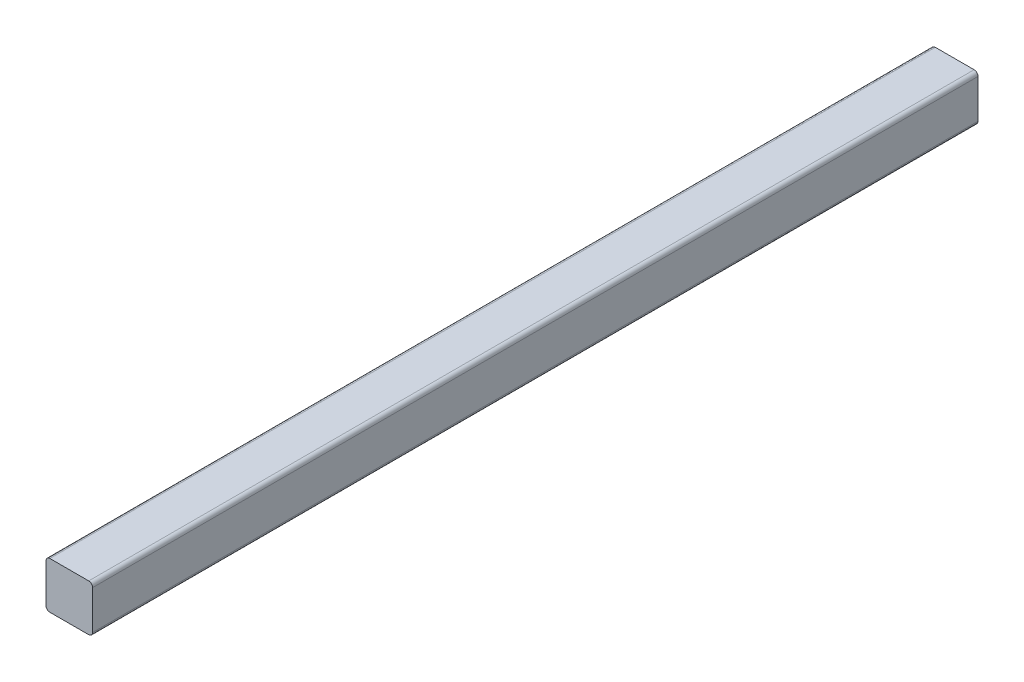
ISO-10303-21;
HEADER;
FILE_DESCRIPTION(('STEP AP214'),'2;1');
FILE_NAME('part.step','',(''),(''),'','','');
FILE_SCHEMA(('AUTOMOTIVE_DESIGN { 1 0 10303 214 1 1 1 1 }'));
ENDSEC;
DATA;
#1=APPLICATION_CONTEXT('core data for automotive mechanical design processes');
#2=APPLICATION_PROTOCOL_DEFINITION('international standard','automotive_design',2000,#1);
#3=PRODUCT_CONTEXT('',#1,'mechanical');
#4=PRODUCT('Part','Part','',(#3));
#5=PRODUCT_RELATED_PRODUCT_CATEGORY('part','',(#4));
#6=PRODUCT_DEFINITION_FORMATION('','',#4);
#7=PRODUCT_DEFINITION_CONTEXT('part definition',#1,'design');
#8=PRODUCT_DEFINITION('design','',#6,#7);
#9=PRODUCT_DEFINITION_SHAPE('','',#8);
#10=(LENGTH_UNIT() NAMED_UNIT(*) SI_UNIT(.MILLI.,.METRE.));
#11=(NAMED_UNIT(*) PLANE_ANGLE_UNIT() SI_UNIT($,.RADIAN.));
#12=(NAMED_UNIT(*) SI_UNIT($,.STERADIAN.) SOLID_ANGLE_UNIT());
#13=UNCERTAINTY_MEASURE_WITH_UNIT(LENGTH_MEASURE(1.E-05),#10,'distance_accuracy_value','');
#14=(GEOMETRIC_REPRESENTATION_CONTEXT(3) GLOBAL_UNCERTAINTY_ASSIGNED_CONTEXT((#13)) GLOBAL_UNIT_ASSIGNED_CONTEXT((#10,
#11,#12)) REPRESENTATION_CONTEXT('',''));
#15=CARTESIAN_POINT('',(0.,0.,0.));
#16=DIRECTION('',(0.,0.,1.));
#17=DIRECTION('',(1.,0.,0.));
#18=AXIS2_PLACEMENT_3D('',#15,#16,#17);
#19=CARTESIAN_POINT('',(19.05,-19.05,723.9));
#20=DIRECTION('',(-1.,0.,0.));
#21=DIRECTION('',(0.,0.,1.));
#22=AXIS2_PLACEMENT_3D('',#19,#20,#21);
#23=PLANE('',#22);
#24=DIRECTION('',(0.,1.,0.));
#25=VECTOR('',#24,1.);
#26=CARTESIAN_POINT('',(19.05,-19.05,723.9));
#27=LINE('',#26,#25);
#28=CARTESIAN_POINT('',(19.05,-15.875,723.9));
#29=VERTEX_POINT('',#28);
#30=CARTESIAN_POINT('',(19.05,15.875,723.9));
#31=VERTEX_POINT('',#30);
#32=EDGE_CURVE('E134',#29,#31,#27,.T.);
#33=ORIENTED_EDGE('',*,*,#32,.F.);
#34=DIRECTION('',(0.,0.,-1.));
#35=VECTOR('',#34,1.);
#36=CARTESIAN_POINT('',(19.05,-15.875,723.9));
#37=LINE('',#36,#35);
#38=CARTESIAN_POINT('',(19.05,-15.875,0.));
#39=VERTEX_POINT('',#38);
#40=EDGE_CURVE('E11',#29,#39,#37,.T.);
#41=ORIENTED_EDGE('',*,*,#40,.T.);
#42=DIRECTION('',(0.,1.,0.));
#43=VECTOR('',#42,1.);
#44=CARTESIAN_POINT('',(19.05,-19.05,0.));
#45=LINE('',#44,#43);
#46=CARTESIAN_POINT('',(19.05,15.875,0.));
#47=VERTEX_POINT('',#46);
#48=EDGE_CURVE('E136',#39,#47,#45,.T.);
#49=ORIENTED_EDGE('',*,*,#48,.T.);
#50=DIRECTION('',(0.,0.,-1.));
#51=VECTOR('',#50,1.);
#52=CARTESIAN_POINT('',(19.05,15.875,723.9));
#53=LINE('',#52,#51);
#54=EDGE_CURVE('E47',#47,#31,#53,.F.);
#55=ORIENTED_EDGE('',*,*,#54,.T.);
#56=EDGE_LOOP('',(#33,#41,#49,#55));
#57=FACE_BOUND('',#56,.T.);
#58=ADVANCED_FACE('F39',(#57),#23,.F.);
#59=CARTESIAN_POINT('',(-19.05,19.05,723.9));
#60=DIRECTION('',(0.,-1.,0.));
#61=DIRECTION('',(0.,0.,-1.));
#62=AXIS2_PLACEMENT_3D('',#59,#60,#61);
#63=PLANE('',#62);
#64=DIRECTION('',(-1.,0.,0.));
#65=VECTOR('',#64,1.);
#66=CARTESIAN_POINT('',(-19.05,19.05,0.));
#67=LINE('',#66,#65);
#68=CARTESIAN_POINT('',(15.875,19.05,0.));
#69=VERTEX_POINT('',#68);
#70=CARTESIAN_POINT('',(-15.875,19.05,0.));
#71=VERTEX_POINT('',#70);
#72=EDGE_CURVE('E132',#69,#71,#67,.T.);
#73=ORIENTED_EDGE('',*,*,#72,.T.);
#74=DIRECTION('',(0.,0.,-1.));
#75=VECTOR('',#74,1.);
#76=CARTESIAN_POINT('',(-15.875,19.05,723.9));
#77=LINE('',#76,#75);
#78=CARTESIAN_POINT('',(-15.875,19.05,723.9));
#79=VERTEX_POINT('',#78);
#80=EDGE_CURVE('E111',#71,#79,#77,.F.);
#81=ORIENTED_EDGE('',*,*,#80,.T.);
#82=DIRECTION('',(-1.,0.,0.));
#83=VECTOR('',#82,1.);
#84=CARTESIAN_POINT('',(-19.05,19.05,723.9));
#85=LINE('',#84,#83);
#86=CARTESIAN_POINT('',(15.875,19.05,723.9));
#87=VERTEX_POINT('',#86);
#88=EDGE_CURVE('E172',#87,#79,#85,.T.);
#89=ORIENTED_EDGE('',*,*,#88,.F.);
#90=DIRECTION('',(0.,0.,-1.));
#91=VECTOR('',#90,1.);
#92=CARTESIAN_POINT('',(15.875,19.05,723.9));
#93=LINE('',#92,#91);
#94=EDGE_CURVE('E116',#87,#69,#93,.T.);
#95=ORIENTED_EDGE('',*,*,#94,.T.);
#96=EDGE_LOOP('',(#73,#81,#89,#95));
#97=FACE_BOUND('',#96,.T.);
#98=ADVANCED_FACE('F176',(#97),#63,.F.);
#99=CARTESIAN_POINT('',(-19.05,-19.05,723.9));
#100=DIRECTION('',(1.,0.,0.));
#101=DIRECTION('',(0.,0.,-1.));
#102=AXIS2_PLACEMENT_3D('',#99,#100,#101);
#103=PLANE('',#102);
#104=DIRECTION('',(0.,-1.,0.));
#105=VECTOR('',#104,1.);
#106=CARTESIAN_POINT('',(-19.05,-19.05,723.9));
#107=LINE('',#106,#105);
#108=CARTESIAN_POINT('',(-19.05,15.875,723.9));
#109=VERTEX_POINT('',#108);
#110=CARTESIAN_POINT('',(-19.05,-15.875,723.9));
#111=VERTEX_POINT('',#110);
#112=EDGE_CURVE('E125',#109,#111,#107,.T.);
#113=ORIENTED_EDGE('',*,*,#112,.F.);
#114=DIRECTION('',(0.,0.,-1.));
#115=VECTOR('',#114,1.);
#116=CARTESIAN_POINT('',(-19.05,15.875,723.9));
#117=LINE('',#116,#115);
#118=CARTESIAN_POINT('',(-19.05,15.875,0.));
#119=VERTEX_POINT('',#118);
#120=EDGE_CURVE('E110',#109,#119,#117,.T.);
#121=ORIENTED_EDGE('',*,*,#120,.T.);
#122=DIRECTION('',(0.,-1.,0.));
#123=VECTOR('',#122,1.);
#124=CARTESIAN_POINT('',(-19.05,-19.05,0.));
#125=LINE('',#124,#123);
#126=CARTESIAN_POINT('',(-19.05,-15.875,0.));
#127=VERTEX_POINT('',#126);
#128=EDGE_CURVE('E123',#119,#127,#125,.T.);
#129=ORIENTED_EDGE('',*,*,#128,.T.);
#130=DIRECTION('',(0.,0.,-1.));
#131=VECTOR('',#130,1.);
#132=CARTESIAN_POINT('',(-19.05,-15.875,723.9));
#133=LINE('',#132,#131);
#134=EDGE_CURVE('E127',#127,#111,#133,.F.);
#135=ORIENTED_EDGE('',*,*,#134,.T.);
#136=EDGE_LOOP('',(#113,#121,#129,#135));
#137=FACE_BOUND('',#136,.T.);
#138=ADVANCED_FACE('F122',(#137),#103,.F.);
#139=CARTESIAN_POINT('',(-19.05,-19.05,723.9));
#140=DIRECTION('',(0.,1.,0.));
#141=DIRECTION('',(0.,0.,1.));
#142=AXIS2_PLACEMENT_3D('',#139,#140,#141);
#143=PLANE('',#142);
#144=DIRECTION('',(1.,0.,0.));
#145=VECTOR('',#144,1.);
#146=CARTESIAN_POINT('',(-19.05,-19.05,723.9));
#147=LINE('',#146,#145);
#148=CARTESIAN_POINT('',(-15.875,-19.05,723.9));
#149=VERTEX_POINT('',#148);
#150=CARTESIAN_POINT('',(15.875,-19.05,723.9));
#151=VERTEX_POINT('',#150);
#152=EDGE_CURVE('E140',#149,#151,#147,.T.);
#153=ORIENTED_EDGE('',*,*,#152,.F.);
#154=DIRECTION('',(0.,0.,-1.));
#155=VECTOR('',#154,1.);
#156=CARTESIAN_POINT('',(-15.875,-19.05,723.9));
#157=LINE('',#156,#155);
#158=CARTESIAN_POINT('',(-15.875,-19.05,0.));
#159=VERTEX_POINT('',#158);
#160=EDGE_CURVE('E157',#149,#159,#157,.T.);
#161=ORIENTED_EDGE('',*,*,#160,.T.);
#162=DIRECTION('',(1.,0.,0.));
#163=VECTOR('',#162,1.);
#164=CARTESIAN_POINT('',(-19.05,-19.05,0.));
#165=LINE('',#164,#163);
#166=CARTESIAN_POINT('',(15.875,-19.05,0.));
#167=VERTEX_POINT('',#166);
#168=EDGE_CURVE('E131',#159,#167,#165,.T.);
#169=ORIENTED_EDGE('',*,*,#168,.T.);
#170=DIRECTION('',(0.,0.,-1.));
#171=VECTOR('',#170,1.);
#172=CARTESIAN_POINT('',(15.875,-19.05,723.9));
#173=LINE('',#172,#171);
#174=EDGE_CURVE('E54',#167,#151,#173,.F.);
#175=ORIENTED_EDGE('',*,*,#174,.T.);
#176=EDGE_LOOP('',(#153,#161,#169,#175));
#177=FACE_BOUND('',#176,.T.);
#178=ADVANCED_FACE('F183',(#177),#143,.F.);
#179=CARTESIAN_POINT('',(0.,0.,723.9));
#180=DIRECTION('',(0.,0.,-1.));
#181=DIRECTION('',(-1.,0.,0.));
#182=AXIS2_PLACEMENT_3D('',#179,#180,#181);
#183=PLANE('',#182);
#184=ORIENTED_EDGE('',*,*,#88,.T.);
#185=CARTESIAN_POINT('',(-15.875,15.875,723.9));
#186=DIRECTION('',(0.,0.,-1.));
#187=DIRECTION('',(-1.,0.,0.));
#188=AXIS2_PLACEMENT_3D('',#185,#186,#187);
#189=CIRCLE('',#188,3.175);
#190=EDGE_CURVE('E154',#79,#109,#189,.F.);
#191=ORIENTED_EDGE('',*,*,#190,.T.);
#192=ORIENTED_EDGE('',*,*,#112,.T.);
#193=CARTESIAN_POINT('',(-15.875,-15.875,723.9));
#194=DIRECTION('',(0.,0.,-1.));
#195=DIRECTION('',(-1.,0.,0.));
#196=AXIS2_PLACEMENT_3D('',#193,#194,#195);
#197=CIRCLE('',#196,3.175);
#198=EDGE_CURVE('E61',#111,#149,#197,.F.);
#199=ORIENTED_EDGE('',*,*,#198,.T.);
#200=ORIENTED_EDGE('',*,*,#152,.T.);
#201=CARTESIAN_POINT('',(15.875,-15.875,723.9));
#202=DIRECTION('',(0.,0.,-1.));
#203=DIRECTION('',(-1.,0.,0.));
#204=AXIS2_PLACEMENT_3D('',#201,#202,#203);
#205=CIRCLE('',#204,3.175);
#206=EDGE_CURVE('E151',#151,#29,#205,.F.);
#207=ORIENTED_EDGE('',*,*,#206,.T.);
#208=ORIENTED_EDGE('',*,*,#32,.T.);
#209=CARTESIAN_POINT('',(15.875,15.875,723.9));
#210=DIRECTION('',(0.,0.,-1.));
#211=DIRECTION('',(-1.,0.,0.));
#212=AXIS2_PLACEMENT_3D('',#209,#210,#211);
#213=CIRCLE('',#212,3.175);
#214=EDGE_CURVE('E149',#31,#87,#213,.F.);
#215=ORIENTED_EDGE('',*,*,#214,.T.);
#216=EDGE_LOOP('',(#184,#191,#192,#199,#200,#207,#208,#215));
#217=FACE_BOUND('',#216,.T.);
#218=ADVANCED_FACE('F169',(#217),#183,.F.);
#219=CARTESIAN_POINT('',(0.,0.,0.));
#220=DIRECTION('',(0.,0.,-1.));
#221=DIRECTION('',(-1.,0.,0.));
#222=AXIS2_PLACEMENT_3D('',#219,#220,#221);
#223=PLANE('',#222);
#224=ORIENTED_EDGE('',*,*,#128,.F.);
#225=CARTESIAN_POINT('',(-15.875,15.875,0.));
#226=DIRECTION('',(0.,0.,-1.));
#227=DIRECTION('',(-1.,0.,0.));
#228=AXIS2_PLACEMENT_3D('',#225,#226,#227);
#229=CIRCLE('',#228,3.175);
#230=EDGE_CURVE('E106',#119,#71,#229,.T.);
#231=ORIENTED_EDGE('',*,*,#230,.T.);
#232=ORIENTED_EDGE('',*,*,#72,.F.);
#233=CARTESIAN_POINT('',(15.875,15.875,0.));
#234=DIRECTION('',(0.,0.,-1.));
#235=DIRECTION('',(-1.,0.,0.));
#236=AXIS2_PLACEMENT_3D('',#233,#234,#235);
#237=CIRCLE('',#236,3.175);
#238=EDGE_CURVE('E126',#69,#47,#237,.T.);
#239=ORIENTED_EDGE('',*,*,#238,.T.);
#240=ORIENTED_EDGE('',*,*,#48,.F.);
#241=CARTESIAN_POINT('',(15.875,-15.875,0.));
#242=DIRECTION('',(0.,0.,-1.));
#243=DIRECTION('',(-1.,0.,0.));
#244=AXIS2_PLACEMENT_3D('',#241,#242,#243);
#245=CIRCLE('',#244,3.175);
#246=EDGE_CURVE('E143',#39,#167,#245,.T.);
#247=ORIENTED_EDGE('',*,*,#246,.T.);
#248=ORIENTED_EDGE('',*,*,#168,.F.);
#249=CARTESIAN_POINT('',(-15.875,-15.875,0.));
#250=DIRECTION('',(0.,0.,-1.));
#251=DIRECTION('',(-1.,0.,0.));
#252=AXIS2_PLACEMENT_3D('',#249,#250,#251);
#253=CIRCLE('',#252,3.175);
#254=EDGE_CURVE('E117',#159,#127,#253,.T.);
#255=ORIENTED_EDGE('',*,*,#254,.T.);
#256=EDGE_LOOP('',(#224,#231,#232,#239,#240,#247,#248,#255));
#257=FACE_BOUND('',#256,.T.);
#258=ADVANCED_FACE('F129',(#257),#223,.T.);
#259=CARTESIAN_POINT('',(-15.875,15.875,723.9));
#260=DIRECTION('',(0.,0.,-1.));
#261=DIRECTION('',(-1.,0.,0.));
#262=AXIS2_PLACEMENT_3D('',#259,#260,#261);
#263=CYLINDRICAL_SURFACE('',#262,3.175);
#264=ORIENTED_EDGE('',*,*,#190,.F.);
#265=ORIENTED_EDGE('',*,*,#80,.F.);
#266=ORIENTED_EDGE('',*,*,#230,.F.);
#267=ORIENTED_EDGE('',*,*,#120,.F.);
#268=EDGE_LOOP('',(#264,#265,#266,#267));
#269=FACE_BOUND('',#268,.T.);
#270=ADVANCED_FACE('F109',(#269),#263,.T.);
#271=CARTESIAN_POINT('',(-15.875,-15.875,723.9));
#272=DIRECTION('',(0.,0.,-1.));
#273=DIRECTION('',(-1.,0.,0.));
#274=AXIS2_PLACEMENT_3D('',#271,#272,#273);
#275=CYLINDRICAL_SURFACE('',#274,3.175);
#276=ORIENTED_EDGE('',*,*,#198,.F.);
#277=ORIENTED_EDGE('',*,*,#134,.F.);
#278=ORIENTED_EDGE('',*,*,#254,.F.);
#279=ORIENTED_EDGE('',*,*,#160,.F.);
#280=EDGE_LOOP('',(#276,#277,#278,#279));
#281=FACE_BOUND('',#280,.T.);
#282=ADVANCED_FACE('F182',(#281),#275,.T.);
#283=CARTESIAN_POINT('',(15.875,-15.875,723.9));
#284=DIRECTION('',(0.,0.,-1.));
#285=DIRECTION('',(-1.,0.,0.));
#286=AXIS2_PLACEMENT_3D('',#283,#284,#285);
#287=CYLINDRICAL_SURFACE('',#286,3.175);
#288=ORIENTED_EDGE('',*,*,#206,.F.);
#289=ORIENTED_EDGE('',*,*,#174,.F.);
#290=ORIENTED_EDGE('',*,*,#246,.F.);
#291=ORIENTED_EDGE('',*,*,#40,.F.);
#292=EDGE_LOOP('',(#288,#289,#290,#291));
#293=FACE_BOUND('',#292,.T.);
#294=ADVANCED_FACE('F185',(#293),#287,.T.);
#295=CARTESIAN_POINT('',(15.875,15.875,723.9));
#296=DIRECTION('',(0.,0.,-1.));
#297=DIRECTION('',(-1.,0.,0.));
#298=AXIS2_PLACEMENT_3D('',#295,#296,#297);
#299=CYLINDRICAL_SURFACE('',#298,3.175);
#300=ORIENTED_EDGE('',*,*,#214,.F.);
#301=ORIENTED_EDGE('',*,*,#54,.F.);
#302=ORIENTED_EDGE('',*,*,#238,.F.);
#303=ORIENTED_EDGE('',*,*,#94,.F.);
#304=EDGE_LOOP('',(#300,#301,#302,#303));
#305=FACE_BOUND('',#304,.T.);
#306=ADVANCED_FACE('F41',(#305),#299,.T.);
#307=CLOSED_SHELL('',(#58,#98,#138,#178,#218,#258,#270,#282,#294,#306));
#308=MANIFOLD_SOLID_BREP('B2',#307);
#309=ADVANCED_BREP_SHAPE_REPRESENTATION('',(#18,#308),#14);
#310=SHAPE_DEFINITION_REPRESENTATION(#9,#309);
ENDSEC;
END-ISO-10303-21;
